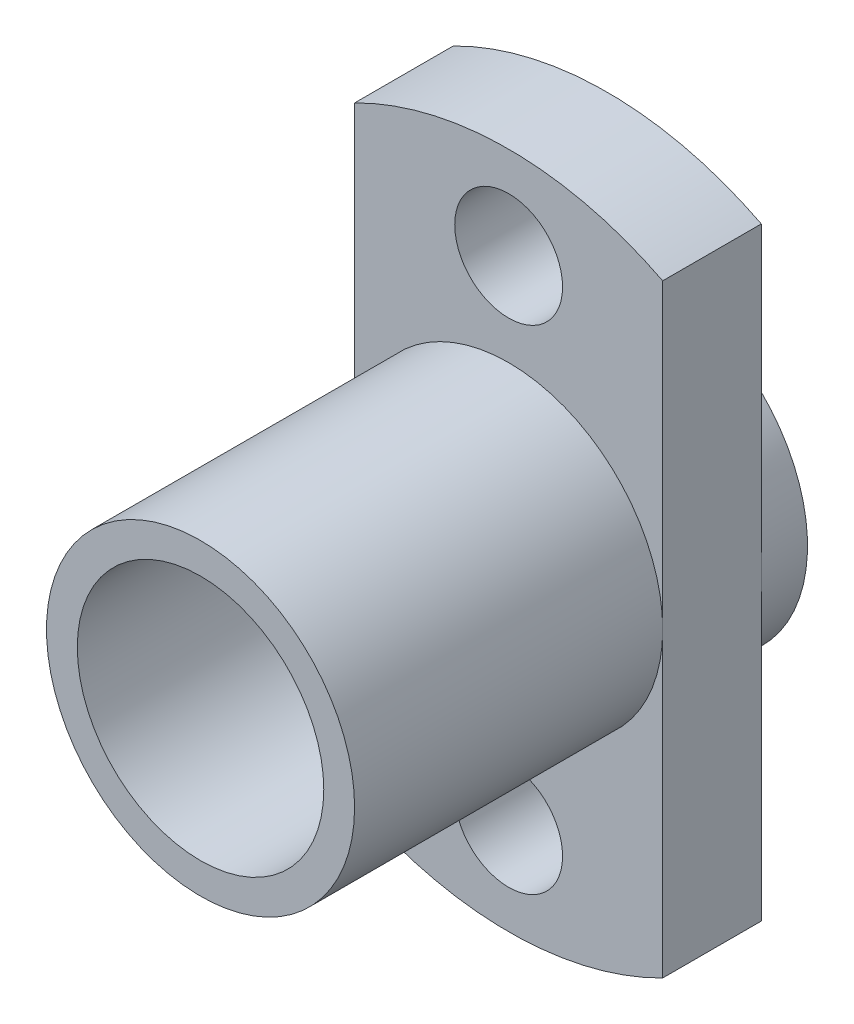
ISO-10303-21;
HEADER;
FILE_DESCRIPTION(('STEP AP214'),'2;1');
FILE_NAME('part.step','',(''),(''),'','','');
FILE_SCHEMA(('AUTOMOTIVE_DESIGN { 1 0 10303 214 1 1 1 1 }'));
ENDSEC;
DATA;
#1=APPLICATION_CONTEXT('core data for automotive mechanical design processes');
#2=APPLICATION_PROTOCOL_DEFINITION('international standard','automotive_design',2000,#1);
#3=PRODUCT_CONTEXT('',#1,'mechanical');
#4=PRODUCT('Part','Part','',(#3));
#5=PRODUCT_RELATED_PRODUCT_CATEGORY('part','',(#4));
#6=PRODUCT_DEFINITION_FORMATION('','',#4);
#7=PRODUCT_DEFINITION_CONTEXT('part definition',#1,'design');
#8=PRODUCT_DEFINITION('design','',#6,#7);
#9=PRODUCT_DEFINITION_SHAPE('','',#8);
#10=(LENGTH_UNIT() NAMED_UNIT(*) SI_UNIT(.MILLI.,.METRE.));
#11=(NAMED_UNIT(*) PLANE_ANGLE_UNIT() SI_UNIT($,.RADIAN.));
#12=(NAMED_UNIT(*) SI_UNIT($,.STERADIAN.) SOLID_ANGLE_UNIT());
#13=UNCERTAINTY_MEASURE_WITH_UNIT(LENGTH_MEASURE(1.E-05),#10,'distance_accuracy_value','');
#14=(GEOMETRIC_REPRESENTATION_CONTEXT(3) GLOBAL_UNCERTAINTY_ASSIGNED_CONTEXT((#13)) GLOBAL_UNIT_ASSIGNED_CONTEXT((#10,
#11,#12)) REPRESENTATION_CONTEXT('',''));
#15=CARTESIAN_POINT('',(0.,0.,0.));
#16=DIRECTION('',(0.,0.,1.));
#17=DIRECTION('',(1.,0.,0.));
#18=AXIS2_PLACEMENT_3D('',#15,#16,#17);
#19=CARTESIAN_POINT('',(0.,0.,0.));
#20=DIRECTION('',(0.,0.,1.));
#21=DIRECTION('',(1.,0.,0.));
#22=AXIS2_PLACEMENT_3D('',#19,#20,#21);
#23=PLANE('',#22);
#24=CARTESIAN_POINT('',(0.,0.,0.));
#25=DIRECTION('',(0.,0.,-1.));
#26=DIRECTION('',(-1.,0.,0.));
#27=AXIS2_PLACEMENT_3D('',#24,#25,#26);
#28=CIRCLE('',#27,5.);
#29=CARTESIAN_POINT('',(-5.,0.,0.));
#30=VERTEX_POINT('',#29);
#31=CARTESIAN_POINT('',(5.,0.,0.));
#32=VERTEX_POINT('',#31);
#33=EDGE_CURVE('E52',#30,#32,#28,.T.);
#34=ORIENTED_EDGE('',*,*,#33,.F.);
#35=DIRECTION('',(0.,1.,0.));
#36=VECTOR('',#35,1.);
#37=CARTESIAN_POINT('',(-5.,0.,0.));
#38=LINE('',#37,#36);
#39=CARTESIAN_POINT('',(-5.,9.79795897113271,0.));
#40=VERTEX_POINT('',#39);
#41=EDGE_CURVE('E99',#30,#40,#38,.T.);
#42=ORIENTED_EDGE('',*,*,#41,.T.);
#43=CARTESIAN_POINT('',(0.,0.,0.));
#44=DIRECTION('',(0.,0.,1.));
#45=DIRECTION('',(1.,0.,0.));
#46=AXIS2_PLACEMENT_3D('',#43,#44,#45);
#47=CIRCLE('',#46,11.);
#48=CARTESIAN_POINT('',(5.,9.79795897113271,0.));
#49=VERTEX_POINT('',#48);
#50=EDGE_CURVE('E200',#49,#40,#47,.T.);
#51=ORIENTED_EDGE('',*,*,#50,.F.);
#52=DIRECTION('',(0.,-1.,0.));
#53=VECTOR('',#52,1.);
#54=CARTESIAN_POINT('',(5.,0.,0.));
#55=LINE('',#54,#53);
#56=EDGE_CURVE('E109',#49,#32,#55,.T.);
#57=ORIENTED_EDGE('',*,*,#56,.T.);
#58=EDGE_LOOP('',(#34,#42,#51,#57));
#59=FACE_BOUND('',#58,.T.);
#60=CARTESIAN_POINT('',(0.,8.,0.));
#61=DIRECTION('',(0.,0.,-1.));
#62=DIRECTION('',(-1.,0.,0.));
#63=AXIS2_PLACEMENT_3D('',#60,#61,#62);
#64=CIRCLE('',#63,1.75);
#65=CARTESIAN_POINT('',(-1.75,8.,0.));
#66=VERTEX_POINT('',#65);
#67=EDGE_CURVE('E172',#66,#66,#64,.T.);
#68=ORIENTED_EDGE('',*,*,#67,.F.);
#69=EDGE_LOOP('',(#68));
#70=FACE_BOUND('',#69,.T.);
#71=ADVANCED_FACE('F41',(#59,#70),#23,.F.);
#72=CARTESIAN_POINT('',(0.,0.,3.2));
#73=DIRECTION('',(0.,0.,-1.));
#74=DIRECTION('',(-1.,0.,0.));
#75=AXIS2_PLACEMENT_3D('',#72,#73,#74);
#76=CYLINDRICAL_SURFACE('',#75,11.);
#77=CARTESIAN_POINT('',(0.,0.,3.2));
#78=DIRECTION('',(0.,0.,1.));
#79=DIRECTION('',(1.,0.,0.));
#80=AXIS2_PLACEMENT_3D('',#77,#78,#79);
#81=CIRCLE('',#80,11.);
#82=CARTESIAN_POINT('',(-5.,-9.79795897113271,3.2));
#83=VERTEX_POINT('',#82);
#84=CARTESIAN_POINT('',(5.,-9.79795897113271,3.2));
#85=VERTEX_POINT('',#84);
#86=EDGE_CURVE('E196',#83,#85,#81,.T.);
#87=ORIENTED_EDGE('',*,*,#86,.F.);
#88=DIRECTION('',(0.,0.,-1.));
#89=VECTOR('',#88,1.);
#90=CARTESIAN_POINT('',(-5.,-9.79795897113271,3.2));
#91=LINE('',#90,#89);
#92=CARTESIAN_POINT('',(-5.,-9.79795897113271,0.));
#93=VERTEX_POINT('',#92);
#94=EDGE_CURVE('E219',#83,#93,#91,.T.);
#95=ORIENTED_EDGE('',*,*,#94,.T.);
#96=CARTESIAN_POINT('',(5.,-9.79795897113271,0.));
#97=VERTEX_POINT('',#96);
#98=EDGE_CURVE('E95',#93,#97,#47,.T.);
#99=ORIENTED_EDGE('',*,*,#98,.T.);
#100=DIRECTION('',(0.,0.,-1.));
#101=VECTOR('',#100,1.);
#102=CARTESIAN_POINT('',(5.,-9.79795897113271,3.2));
#103=LINE('',#102,#101);
#104=EDGE_CURVE('E215',#97,#85,#103,.F.);
#105=ORIENTED_EDGE('',*,*,#104,.T.);
#106=EDGE_LOOP('',(#87,#95,#99,#105));
#107=FACE_BOUND('',#106,.T.);
#108=ADVANCED_FACE('F130',(#107),#76,.T.);
#109=CARTESIAN_POINT('',(0.,0.,3.2));
#110=DIRECTION('',(0.,0.,1.));
#111=DIRECTION('',(1.,0.,0.));
#112=AXIS2_PLACEMENT_3D('',#109,#110,#111);
#113=PLANE('',#112);
#114=DIRECTION('',(0.,1.,0.));
#115=VECTOR('',#114,1.);
#116=CARTESIAN_POINT('',(-5.,0.,3.2));
#117=LINE('',#116,#115);
#118=CARTESIAN_POINT('',(-5.,0.,3.2));
#119=VERTEX_POINT('',#118);
#120=EDGE_CURVE('E164',#83,#119,#117,.T.);
#121=ORIENTED_EDGE('',*,*,#120,.F.);
#122=ORIENTED_EDGE('',*,*,#86,.T.);
#123=DIRECTION('',(0.,-1.,0.));
#124=VECTOR('',#123,1.);
#125=CARTESIAN_POINT('',(5.,-9.81215194171264,3.2));
#126=LINE('',#125,#124);
#127=CARTESIAN_POINT('',(5.,0.,3.2));
#128=VERTEX_POINT('',#127);
#129=EDGE_CURVE('E260',#128,#85,#126,.T.);
#130=ORIENTED_EDGE('',*,*,#129,.F.);
#131=CARTESIAN_POINT('',(0.,0.,3.2));
#132=DIRECTION('',(0.,0.,1.));
#133=DIRECTION('',(1.,0.,0.));
#134=AXIS2_PLACEMENT_3D('',#131,#132,#133);
#135=CIRCLE('',#134,5.);
#136=EDGE_CURVE('E195',#119,#128,#135,.T.);
#137=ORIENTED_EDGE('',*,*,#136,.F.);
#138=EDGE_LOOP('',(#121,#122,#130,#137));
#139=FACE_BOUND('',#138,.T.);
#140=CARTESIAN_POINT('',(-1.8045484750061E-13,-8.,3.2));
#141=DIRECTION('',(0.,0.,1.));
#142=DIRECTION('',(1.,0.,0.));
#143=AXIS2_PLACEMENT_3D('',#140,#141,#142);
#144=CIRCLE('',#143,1.75);
#145=CARTESIAN_POINT('',(1.74999999999982,-8.,3.2));
#146=VERTEX_POINT('',#145);
#147=EDGE_CURVE('E168',#146,#146,#144,.T.);
#148=ORIENTED_EDGE('',*,*,#147,.F.);
#149=EDGE_LOOP('',(#148));
#150=FACE_BOUND('',#149,.T.);
#151=ADVANCED_FACE('F136',(#139,#150),#113,.T.);
#152=ORIENTED_EDGE('',*,*,#50,.T.);
#153=DIRECTION('',(0.,0.,-1.));
#154=VECTOR('',#153,1.);
#155=CARTESIAN_POINT('',(-5.,9.79795897113271,3.2));
#156=LINE('',#155,#154);
#157=CARTESIAN_POINT('',(-5.,9.79795897113271,3.2));
#158=VERTEX_POINT('',#157);
#159=EDGE_CURVE('E104',#40,#158,#156,.F.);
#160=ORIENTED_EDGE('',*,*,#159,.T.);
#161=CARTESIAN_POINT('',(5.,9.79795897113271,3.2));
#162=VERTEX_POINT('',#161);
#163=EDGE_CURVE('E199',#162,#158,#81,.T.);
#164=ORIENTED_EDGE('',*,*,#163,.F.);
#165=DIRECTION('',(0.,0.,-1.));
#166=VECTOR('',#165,1.);
#167=CARTESIAN_POINT('',(5.,9.79795897113271,3.2));
#168=LINE('',#167,#166);
#169=EDGE_CURVE('E211',#162,#49,#168,.T.);
#170=ORIENTED_EDGE('',*,*,#169,.T.);
#171=EDGE_LOOP('',(#152,#160,#164,#170));
#172=FACE_BOUND('',#171,.T.);
#173=ADVANCED_FACE('F43',(#172),#76,.T.);
#174=EDGE_CURVE('E256',#119,#158,#117,.T.);
#175=ORIENTED_EDGE('',*,*,#174,.F.);
#176=EDGE_CURVE('E191',#128,#119,#135,.T.);
#177=ORIENTED_EDGE('',*,*,#176,.F.);
#178=EDGE_CURVE('E255',#162,#128,#126,.T.);
#179=ORIENTED_EDGE('',*,*,#178,.F.);
#180=ORIENTED_EDGE('',*,*,#163,.T.);
#181=EDGE_LOOP('',(#175,#177,#179,#180));
#182=FACE_BOUND('',#181,.T.);
#183=CARTESIAN_POINT('',(0.,8.,3.2));
#184=DIRECTION('',(0.,0.,1.));
#185=DIRECTION('',(1.,0.,0.));
#186=AXIS2_PLACEMENT_3D('',#183,#184,#185);
#187=CIRCLE('',#186,1.75);
#188=CARTESIAN_POINT('',(1.75,8.,3.2));
#189=VERTEX_POINT('',#188);
#190=EDGE_CURVE('E171',#189,#189,#187,.T.);
#191=ORIENTED_EDGE('',*,*,#190,.F.);
#192=EDGE_LOOP('',(#191));
#193=FACE_BOUND('',#192,.T.);
#194=ADVANCED_FACE('F140',(#182,#193),#113,.T.);
#195=EDGE_CURVE('E11',#32,#30,#28,.T.);
#196=ORIENTED_EDGE('',*,*,#195,.F.);
#197=EDGE_CURVE('E61',#32,#97,#55,.T.);
#198=ORIENTED_EDGE('',*,*,#197,.T.);
#199=ORIENTED_EDGE('',*,*,#98,.F.);
#200=EDGE_CURVE('E45',#93,#30,#38,.T.);
#201=ORIENTED_EDGE('',*,*,#200,.T.);
#202=EDGE_LOOP('',(#196,#198,#199,#201));
#203=FACE_BOUND('',#202,.T.);
#204=CARTESIAN_POINT('',(-1.8045484750061E-13,-8.,0.));
#205=DIRECTION('',(0.,0.,-1.));
#206=DIRECTION('',(-1.,0.,0.));
#207=AXIS2_PLACEMENT_3D('',#204,#205,#206);
#208=CIRCLE('',#207,1.75);
#209=CARTESIAN_POINT('',(-1.75000000000018,-8.,0.));
#210=VERTEX_POINT('',#209);
#211=EDGE_CURVE('E180',#210,#210,#208,.T.);
#212=ORIENTED_EDGE('',*,*,#211,.F.);
#213=EDGE_LOOP('',(#212));
#214=FACE_BOUND('',#213,.T.);
#215=ADVANCED_FACE('F92',(#203,#214),#23,.F.);
#216=CARTESIAN_POINT('',(0.,0.,13.2));
#217=DIRECTION('',(0.,0.,-1.));
#218=DIRECTION('',(-1.,0.,0.));
#219=AXIS2_PLACEMENT_3D('',#216,#217,#218);
#220=CYLINDRICAL_SURFACE('',#219,5.);
#221=CARTESIAN_POINT('',(0.,0.,13.2));
#222=DIRECTION('',(0.,0.,1.));
#223=DIRECTION('',(1.,0.,0.));
#224=AXIS2_PLACEMENT_3D('',#221,#222,#223);
#225=CIRCLE('',#224,5.);
#226=CARTESIAN_POINT('',(5.,0.,13.2));
#227=VERTEX_POINT('',#226);
#228=EDGE_CURVE('E187',#227,#227,#225,.T.);
#229=ORIENTED_EDGE('',*,*,#228,.F.);
#230=EDGE_LOOP('',(#229));
#231=FACE_BOUND('',#230,.T.);
#232=ORIENTED_EDGE('',*,*,#176,.T.);
#233=ORIENTED_EDGE('',*,*,#136,.T.);
#234=EDGE_LOOP('',(#232,#233));
#235=FACE_BOUND('',#234,.T.);
#236=ADVANCED_FACE('F139',(#231,#235),#220,.T.);
#237=CARTESIAN_POINT('',(0.,0.,13.2));
#238=DIRECTION('',(0.,0.,1.));
#239=DIRECTION('',(1.,0.,0.));
#240=AXIS2_PLACEMENT_3D('',#237,#238,#239);
#241=PLANE('',#240);
#242=CARTESIAN_POINT('',(0.,0.,13.2));
#243=DIRECTION('',(0.,0.,1.));
#244=DIRECTION('',(1.,0.,0.));
#245=AXIS2_PLACEMENT_3D('',#242,#243,#244);
#246=CIRCLE('',#245,4.);
#247=CARTESIAN_POINT('',(4.,0.,13.2));
#248=VERTEX_POINT('',#247);
#249=EDGE_CURVE('E177',#248,#248,#246,.T.);
#250=ORIENTED_EDGE('',*,*,#249,.F.);
#251=EDGE_LOOP('',(#250));
#252=FACE_BOUND('',#251,.T.);
#253=ORIENTED_EDGE('',*,*,#228,.T.);
#254=EDGE_LOOP('',(#253));
#255=FACE_BOUND('',#254,.T.);
#256=ADVANCED_FACE('F145',(#252,#255),#241,.T.);
#257=CARTESIAN_POINT('',(0.,0.,-1.8));
#258=DIRECTION('',(0.,0.,1.));
#259=DIRECTION('',(1.,0.,0.));
#260=AXIS2_PLACEMENT_3D('',#257,#258,#259);
#261=CYLINDRICAL_SURFACE('',#260,4.);
#262=ORIENTED_EDGE('',*,*,#249,.T.);
#263=EDGE_LOOP('',(#262));
#264=FACE_BOUND('',#263,.T.);
#265=CARTESIAN_POINT('',(0.,0.,-1.5));
#266=DIRECTION('',(0.,0.,-1.));
#267=DIRECTION('',(-1.,0.,0.));
#268=AXIS2_PLACEMENT_3D('',#265,#266,#267);
#269=CIRCLE('',#268,4.);
#270=CARTESIAN_POINT('',(-4.,0.,-1.5));
#271=VERTEX_POINT('',#270);
#272=EDGE_CURVE('E116',#271,#271,#269,.T.);
#273=ORIENTED_EDGE('',*,*,#272,.T.);
#274=EDGE_LOOP('',(#273));
#275=FACE_BOUND('',#274,.T.);
#276=ADVANCED_FACE('F233',(#264,#275),#261,.F.);
#277=CARTESIAN_POINT('',(-1.8045484750061E-13,-8.,7.));
#278=DIRECTION('',(0.,0.,-1.));
#279=DIRECTION('',(-1.,0.,0.));
#280=AXIS2_PLACEMENT_3D('',#277,#278,#279);
#281=CYLINDRICAL_SURFACE('',#280,1.75);
#282=ORIENTED_EDGE('',*,*,#147,.T.);
#283=EDGE_LOOP('',(#282));
#284=FACE_BOUND('',#283,.T.);
#285=ORIENTED_EDGE('',*,*,#211,.T.);
#286=EDGE_LOOP('',(#285));
#287=FACE_BOUND('',#286,.T.);
#288=ADVANCED_FACE('F230',(#284,#287),#281,.F.);
#289=CARTESIAN_POINT('',(0.,8.,7.));
#290=DIRECTION('',(0.,0.,-1.));
#291=DIRECTION('',(-1.,0.,0.));
#292=AXIS2_PLACEMENT_3D('',#289,#290,#291);
#293=CYLINDRICAL_SURFACE('',#292,1.75);
#294=ORIENTED_EDGE('',*,*,#190,.T.);
#295=EDGE_LOOP('',(#294));
#296=FACE_BOUND('',#295,.T.);
#297=ORIENTED_EDGE('',*,*,#67,.T.);
#298=EDGE_LOOP('',(#297));
#299=FACE_BOUND('',#298,.T.);
#300=ADVANCED_FACE('F232',(#296,#299),#293,.F.);
#301=CARTESIAN_POINT('',(5.,-9.81215194171264,0.));
#302=DIRECTION('',(-1.,0.,0.));
#303=DIRECTION('',(0.,0.,1.));
#304=AXIS2_PLACEMENT_3D('',#301,#302,#303);
#305=PLANE('',#304);
#306=ORIENTED_EDGE('',*,*,#178,.T.);
#307=ORIENTED_EDGE('',*,*,#129,.T.);
#308=ORIENTED_EDGE('',*,*,#104,.F.);
#309=ORIENTED_EDGE('',*,*,#197,.F.);
#310=ORIENTED_EDGE('',*,*,#56,.F.);
#311=ORIENTED_EDGE('',*,*,#169,.F.);
#312=EDGE_LOOP('',(#306,#307,#308,#309,#310,#311));
#313=FACE_BOUND('',#312,.T.);
#314=ADVANCED_FACE('F239',(#313),#305,.F.);
#315=CARTESIAN_POINT('',(-5.,0.,0.));
#316=DIRECTION('',(1.,0.,0.));
#317=DIRECTION('',(0.,0.,-1.));
#318=AXIS2_PLACEMENT_3D('',#315,#316,#317);
#319=PLANE('',#318);
#320=ORIENTED_EDGE('',*,*,#120,.T.);
#321=ORIENTED_EDGE('',*,*,#174,.T.);
#322=ORIENTED_EDGE('',*,*,#159,.F.);
#323=ORIENTED_EDGE('',*,*,#41,.F.);
#324=ORIENTED_EDGE('',*,*,#200,.F.);
#325=ORIENTED_EDGE('',*,*,#94,.F.);
#326=EDGE_LOOP('',(#320,#321,#322,#323,#324,#325));
#327=FACE_BOUND('',#326,.T.);
#328=ADVANCED_FACE('F102',(#327),#319,.F.);
#329=CARTESIAN_POINT('',(0.,0.,-1.5));
#330=DIRECTION('',(0.,0.,-1.));
#331=DIRECTION('',(-1.,0.,0.));
#332=AXIS2_PLACEMENT_3D('',#329,#330,#331);
#333=PLANE('',#332);
#334=CARTESIAN_POINT('',(0.,0.,-1.5));
#335=DIRECTION('',(0.,0.,-1.));
#336=DIRECTION('',(-1.,0.,0.));
#337=AXIS2_PLACEMENT_3D('',#334,#335,#336);
#338=CIRCLE('',#337,5.);
#339=CARTESIAN_POINT('',(-5.,0.,-1.5));
#340=VERTEX_POINT('',#339);
#341=EDGE_CURVE('E115',#340,#340,#338,.T.);
#342=ORIENTED_EDGE('',*,*,#341,.T.);
#343=EDGE_LOOP('',(#342));
#344=FACE_BOUND('',#343,.T.);
#345=ORIENTED_EDGE('',*,*,#272,.F.);
#346=EDGE_LOOP('',(#345));
#347=FACE_BOUND('',#346,.T.);
#348=ADVANCED_FACE('F119',(#344,#347),#333,.T.);
#349=CARTESIAN_POINT('',(0.,0.,-1.5));
#350=DIRECTION('',(0.,0.,1.));
#351=DIRECTION('',(1.,0.,0.));
#352=AXIS2_PLACEMENT_3D('',#349,#350,#351);
#353=CYLINDRICAL_SURFACE('',#352,5.);
#354=ORIENTED_EDGE('',*,*,#341,.F.);
#355=EDGE_LOOP('',(#354));
#356=FACE_BOUND('',#355,.T.);
#357=ORIENTED_EDGE('',*,*,#33,.T.);
#358=ORIENTED_EDGE('',*,*,#195,.T.);
#359=EDGE_LOOP('',(#357,#358));
#360=FACE_BOUND('',#359,.T.);
#361=ADVANCED_FACE('F117',(#356,#360),#353,.T.);
#362=CLOSED_SHELL('',(#71,#108,#151,#173,#194,#215,#236,#256,#276,#288,#300,#314,#328,#348,#361));
#363=MANIFOLD_SOLID_BREP('B2',#362);
#364=ADVANCED_BREP_SHAPE_REPRESENTATION('',(#18,#363),#14);
#365=SHAPE_DEFINITION_REPRESENTATION(#9,#364);
ENDSEC;
END-ISO-10303-21;
